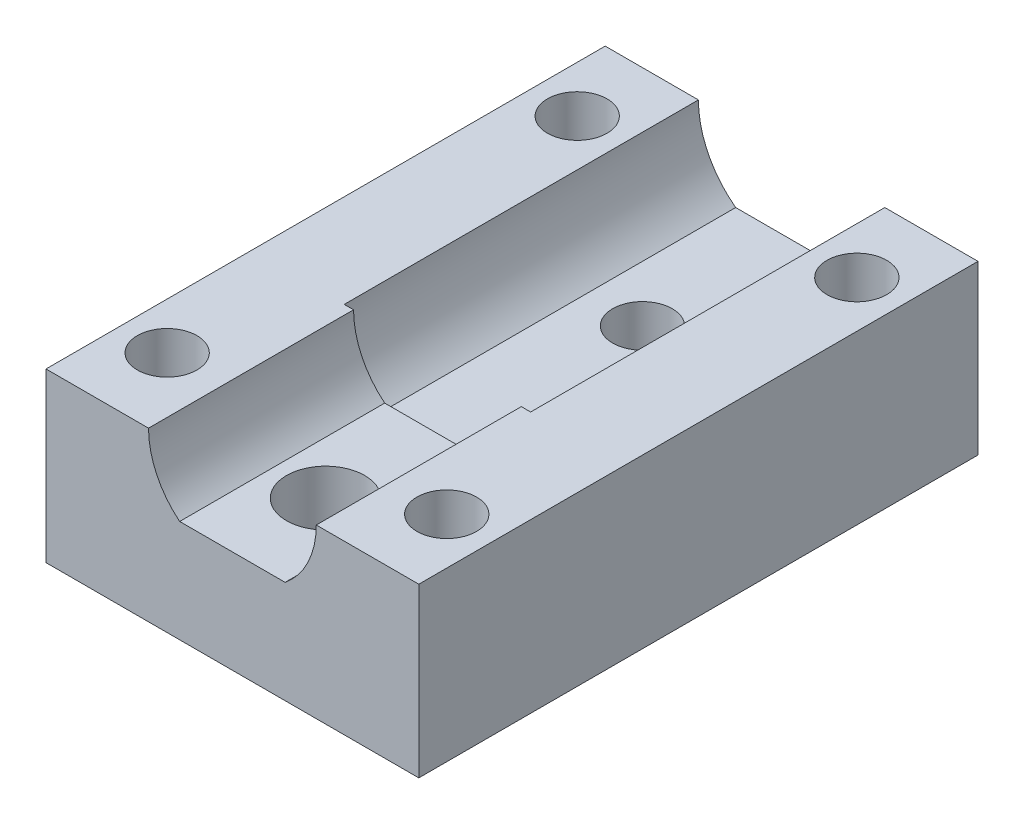
ISO-10303-21;
HEADER;
FILE_DESCRIPTION(('STEP AP214'),'2;1');
FILE_NAME('part.step','',(''),(''),'','','');
FILE_SCHEMA(('AUTOMOTIVE_DESIGN { 1 0 10303 214 1 1 1 1 }'));
ENDSEC;
DATA;
#1=APPLICATION_CONTEXT('core data for automotive mechanical design processes');
#2=APPLICATION_PROTOCOL_DEFINITION('international standard','automotive_design',2000,#1);
#3=PRODUCT_CONTEXT('',#1,'mechanical');
#4=PRODUCT('Part','Part','',(#3));
#5=PRODUCT_RELATED_PRODUCT_CATEGORY('part','',(#4));
#6=PRODUCT_DEFINITION_FORMATION('','',#4);
#7=PRODUCT_DEFINITION_CONTEXT('part definition',#1,'design');
#8=PRODUCT_DEFINITION('design','',#6,#7);
#9=PRODUCT_DEFINITION_SHAPE('','',#8);
#10=(LENGTH_UNIT() NAMED_UNIT(*) SI_UNIT(.MILLI.,.METRE.));
#11=(NAMED_UNIT(*) PLANE_ANGLE_UNIT() SI_UNIT($,.RADIAN.));
#12=(NAMED_UNIT(*) SI_UNIT($,.STERADIAN.) SOLID_ANGLE_UNIT());
#13=UNCERTAINTY_MEASURE_WITH_UNIT(LENGTH_MEASURE(1.E-05),#10,'distance_accuracy_value','');
#14=(GEOMETRIC_REPRESENTATION_CONTEXT(3) GLOBAL_UNCERTAINTY_ASSIGNED_CONTEXT((#13)) GLOBAL_UNIT_ASSIGNED_CONTEXT((#10,
#11,#12)) REPRESENTATION_CONTEXT('',''));
#15=CARTESIAN_POINT('',(0.,0.,0.));
#16=DIRECTION('',(0.,0.,1.));
#17=DIRECTION('',(1.,0.,0.));
#18=AXIS2_PLACEMENT_3D('',#15,#16,#17);
#19=CARTESIAN_POINT('',(0.,9.,4.));
#20=DIRECTION('',(0.,0.,-1.));
#21=DIRECTION('',(-1.,0.,0.));
#22=AXIS2_PLACEMENT_3D('',#19,#20,#21);
#23=PLANE('',#22);
#24=CARTESIAN_POINT('',(0.,9.,4.));
#25=DIRECTION('',(0.,0.,1.));
#26=DIRECTION('',(1.,0.,0.));
#27=AXIS2_PLACEMENT_3D('',#24,#25,#26);
#28=CIRCLE('',#27,4.5);
#29=CARTESIAN_POINT('',(2.82842712474619,5.5,4.));
#30=VERTEX_POINT('',#29);
#31=CARTESIAN_POINT('',(4.5,9.,4.));
#32=VERTEX_POINT('',#31);
#33=EDGE_CURVE('E127',#30,#32,#28,.T.);
#34=ORIENTED_EDGE('',*,*,#33,.T.);
#35=DIRECTION('',(-1.,0.,0.));
#36=VECTOR('',#35,1.);
#37=CARTESIAN_POINT('',(0.,9.,4.));
#38=LINE('',#37,#36);
#39=CARTESIAN_POINT('',(5.,9.,4.));
#40=VERTEX_POINT('',#39);
#41=EDGE_CURVE('E114',#32,#40,#38,.F.);
#42=ORIENTED_EDGE('',*,*,#41,.T.);
#43=CARTESIAN_POINT('',(0.,9.,4.));
#44=DIRECTION('',(0.,0.,-1.));
#45=DIRECTION('',(-1.,0.,0.));
#46=AXIS2_PLACEMENT_3D('',#43,#44,#45);
#47=CIRCLE('',#46,5.);
#48=CARTESIAN_POINT('',(3.,5.,4.));
#49=VERTEX_POINT('',#48);
#50=EDGE_CURVE('E113',#40,#49,#47,.T.);
#51=ORIENTED_EDGE('',*,*,#50,.T.);
#52=DIRECTION('',(1.,0.,0.));
#53=VECTOR('',#52,1.);
#54=CARTESIAN_POINT('',(3.,5.,4.));
#55=LINE('',#54,#53);
#56=CARTESIAN_POINT('',(-3.,5.,4.));
#57=VERTEX_POINT('',#56);
#58=EDGE_CURVE('E112',#49,#57,#55,.F.);
#59=ORIENTED_EDGE('',*,*,#58,.T.);
#60=CARTESIAN_POINT('',(0.,9.,4.));
#61=DIRECTION('',(0.,0.,-1.));
#62=DIRECTION('',(-1.,0.,0.));
#63=AXIS2_PLACEMENT_3D('',#60,#61,#62);
#64=CIRCLE('',#63,5.);
#65=CARTESIAN_POINT('',(-5.,9.,4.));
#66=VERTEX_POINT('',#65);
#67=EDGE_CURVE('E20',#57,#66,#64,.T.);
#68=ORIENTED_EDGE('',*,*,#67,.T.);
#69=DIRECTION('',(1.,0.,0.));
#70=VECTOR('',#69,1.);
#71=CARTESIAN_POINT('',(0.,9.,4.));
#72=LINE('',#71,#70);
#73=CARTESIAN_POINT('',(-4.5,9.,4.));
#74=VERTEX_POINT('',#73);
#75=EDGE_CURVE('E109',#74,#66,#72,.F.);
#76=ORIENTED_EDGE('',*,*,#75,.F.);
#77=CARTESIAN_POINT('',(0.,9.,4.));
#78=DIRECTION('',(0.,0.,1.));
#79=DIRECTION('',(1.,0.,0.));
#80=AXIS2_PLACEMENT_3D('',#77,#78,#79);
#81=CIRCLE('',#80,4.5);
#82=CARTESIAN_POINT('',(-2.82842712474619,5.5,4.));
#83=VERTEX_POINT('',#82);
#84=EDGE_CURVE('E199',#74,#83,#81,.T.);
#85=ORIENTED_EDGE('',*,*,#84,.T.);
#86=DIRECTION('',(1.,0.,0.));
#87=VECTOR('',#86,1.);
#88=CARTESIAN_POINT('',(-2.82842712474619,5.5,4.));
#89=LINE('',#88,#87);
#90=EDGE_CURVE('E135',#83,#30,#89,.T.);
#91=ORIENTED_EDGE('',*,*,#90,.T.);
#92=EDGE_LOOP('',(#34,#42,#51,#59,#68,#76,#85,#91));
#93=FACE_BOUND('',#92,.T.);
#94=ADVANCED_FACE('F17',(#93),#23,.T.);
#95=CARTESIAN_POINT('',(0.,9.,4.));
#96=DIRECTION('',(0.,0.,-1.));
#97=DIRECTION('',(-1.,0.,0.));
#98=AXIS2_PLACEMENT_3D('',#95,#96,#97);
#99=CYLINDRICAL_SURFACE('',#98,5.);
#100=ORIENTED_EDGE('',*,*,#67,.F.);
#101=DIRECTION('',(0.,0.,-1.));
#102=VECTOR('',#101,1.);
#103=CARTESIAN_POINT('',(-3.,5.,4.));
#104=LINE('',#103,#102);
#105=CARTESIAN_POINT('',(-3.,5.,-15.));
#106=VERTEX_POINT('',#105);
#107=EDGE_CURVE('E129',#57,#106,#104,.T.);
#108=ORIENTED_EDGE('',*,*,#107,.T.);
#109=CARTESIAN_POINT('',(0.,9.,-15.));
#110=DIRECTION('',(0.,0.,-1.));
#111=DIRECTION('',(-1.,0.,0.));
#112=AXIS2_PLACEMENT_3D('',#109,#110,#111);
#113=CIRCLE('',#112,5.);
#114=CARTESIAN_POINT('',(-5.,9.,-15.));
#115=VERTEX_POINT('',#114);
#116=EDGE_CURVE('E126',#106,#115,#113,.T.);
#117=ORIENTED_EDGE('',*,*,#116,.T.);
#118=DIRECTION('',(0.,0.,1.));
#119=VECTOR('',#118,1.);
#120=CARTESIAN_POINT('',(-5.,9.,0.));
#121=LINE('',#120,#119);
#122=EDGE_CURVE('E119',#66,#115,#121,.F.);
#123=ORIENTED_EDGE('',*,*,#122,.F.);
#124=EDGE_LOOP('',(#100,#108,#117,#123));
#125=FACE_BOUND('',#124,.T.);
#126=ADVANCED_FACE('F125',(#125),#99,.F.);
#127=CARTESIAN_POINT('',(0.,9.,4.));
#128=DIRECTION('',(0.,0.,-1.));
#129=DIRECTION('',(-1.,0.,0.));
#130=AXIS2_PLACEMENT_3D('',#127,#128,#129);
#131=CYLINDRICAL_SURFACE('',#130,5.);
#132=CARTESIAN_POINT('',(0.,9.,-15.));
#133=DIRECTION('',(0.,0.,-1.));
#134=DIRECTION('',(-1.,0.,0.));
#135=AXIS2_PLACEMENT_3D('',#132,#133,#134);
#136=CIRCLE('',#135,5.);
#137=CARTESIAN_POINT('',(5.,9.,-15.));
#138=VERTEX_POINT('',#137);
#139=CARTESIAN_POINT('',(3.,5.,-15.));
#140=VERTEX_POINT('',#139);
#141=EDGE_CURVE('E173',#138,#140,#136,.T.);
#142=ORIENTED_EDGE('',*,*,#141,.T.);
#143=DIRECTION('',(0.,0.,-1.));
#144=VECTOR('',#143,1.);
#145=CARTESIAN_POINT('',(3.,5.,4.));
#146=LINE('',#145,#144);
#147=EDGE_CURVE('E142',#140,#49,#146,.F.);
#148=ORIENTED_EDGE('',*,*,#147,.T.);
#149=ORIENTED_EDGE('',*,*,#50,.F.);
#150=DIRECTION('',(0.,0.,1.));
#151=VECTOR('',#150,1.);
#152=CARTESIAN_POINT('',(5.,9.,0.));
#153=LINE('',#152,#151);
#154=EDGE_CURVE('E209',#138,#40,#153,.T.);
#155=ORIENTED_EDGE('',*,*,#154,.F.);
#156=EDGE_LOOP('',(#142,#148,#149,#155));
#157=FACE_BOUND('',#156,.T.);
#158=ADVANCED_FACE('F347',(#157),#131,.F.);
#159=CARTESIAN_POINT('',(3.,5.,4.));
#160=DIRECTION('',(0.,-1.,0.));
#161=DIRECTION('',(0.,0.,-1.));
#162=AXIS2_PLACEMENT_3D('',#159,#160,#161);
#163=PLANE('',#162);
#164=ORIENTED_EDGE('',*,*,#107,.F.);
#165=ORIENTED_EDGE('',*,*,#58,.F.);
#166=ORIENTED_EDGE('',*,*,#147,.F.);
#167=DIRECTION('',(1.,0.,0.));
#168=VECTOR('',#167,1.);
#169=CARTESIAN_POINT('',(-10.,5.,-15.));
#170=LINE('',#169,#168);
#171=EDGE_CURVE('E176',#140,#106,#170,.F.);
#172=ORIENTED_EDGE('',*,*,#171,.T.);
#173=EDGE_LOOP('',(#164,#165,#166,#172));
#174=FACE_BOUND('',#173,.T.);
#175=CARTESIAN_POINT('',(0.,5.,-7.));
#176=DIRECTION('',(0.,-1.,0.));
#177=DIRECTION('',(0.,0.,-1.));
#178=AXIS2_PLACEMENT_3D('',#175,#176,#177);
#179=CIRCLE('',#178,1.6);
#180=CARTESIAN_POINT('',(0.,5.,-8.6));
#181=VERTEX_POINT('',#180);
#182=EDGE_CURVE('E183',#181,#181,#179,.T.);
#183=ORIENTED_EDGE('',*,*,#182,.T.);
#184=EDGE_LOOP('',(#183));
#185=FACE_BOUND('',#184,.T.);
#186=ADVANCED_FACE('F344',(#174,#185),#163,.F.);
#187=CARTESIAN_POINT('',(0.,9.,4.));
#188=DIRECTION('',(0.,0.,1.));
#189=DIRECTION('',(1.,0.,0.));
#190=AXIS2_PLACEMENT_3D('',#187,#188,#189);
#191=CYLINDRICAL_SURFACE('',#190,4.5);
#192=DIRECTION('',(0.,0.,1.));
#193=VECTOR('',#192,1.);
#194=CARTESIAN_POINT('',(4.5,9.,0.));
#195=LINE('',#194,#193);
#196=CARTESIAN_POINT('',(4.5,9.,15.));
#197=VERTEX_POINT('',#196);
#198=EDGE_CURVE('E198',#32,#197,#195,.T.);
#199=ORIENTED_EDGE('',*,*,#198,.F.);
#200=ORIENTED_EDGE('',*,*,#33,.F.);
#201=DIRECTION('',(0.,0.,-1.));
#202=VECTOR('',#201,1.);
#203=CARTESIAN_POINT('',(2.82842712474619,5.5,4.));
#204=LINE('',#203,#202);
#205=CARTESIAN_POINT('',(2.82842712474619,5.5,15.));
#206=VERTEX_POINT('',#205);
#207=EDGE_CURVE('E138',#30,#206,#204,.F.);
#208=ORIENTED_EDGE('',*,*,#207,.T.);
#209=CARTESIAN_POINT('',(0.,9.,15.));
#210=DIRECTION('',(0.,0.,1.));
#211=DIRECTION('',(1.,0.,0.));
#212=AXIS2_PLACEMENT_3D('',#209,#210,#211);
#213=CIRCLE('',#212,4.5);
#214=EDGE_CURVE('E168',#206,#197,#213,.T.);
#215=ORIENTED_EDGE('',*,*,#214,.T.);
#216=EDGE_LOOP('',(#199,#200,#208,#215));
#217=FACE_BOUND('',#216,.T.);
#218=ADVANCED_FACE('F286',(#217),#191,.F.);
#219=CARTESIAN_POINT('',(0.,9.,0.));
#220=DIRECTION('',(0.,1.,0.));
#221=DIRECTION('',(0.,0.,1.));
#222=AXIS2_PLACEMENT_3D('',#219,#220,#221);
#223=PLANE('',#222);
#224=DIRECTION('',(0.,0.,1.));
#225=VECTOR('',#224,1.);
#226=CARTESIAN_POINT('',(-4.5,9.,4.));
#227=LINE('',#226,#225);
#228=CARTESIAN_POINT('',(-4.5,9.,15.));
#229=VERTEX_POINT('',#228);
#230=EDGE_CURVE('E122',#229,#74,#227,.F.);
#231=ORIENTED_EDGE('',*,*,#230,.T.);
#232=ORIENTED_EDGE('',*,*,#75,.T.);
#233=ORIENTED_EDGE('',*,*,#122,.T.);
#234=DIRECTION('',(1.,0.,0.));
#235=VECTOR('',#234,1.);
#236=CARTESIAN_POINT('',(-10.,9.,-15.));
#237=LINE('',#236,#235);
#238=CARTESIAN_POINT('',(-10.,9.,-15.));
#239=VERTEX_POINT('',#238);
#240=EDGE_CURVE('E179',#115,#239,#237,.F.);
#241=ORIENTED_EDGE('',*,*,#240,.T.);
#242=DIRECTION('',(0.,0.,-1.));
#243=VECTOR('',#242,1.);
#244=CARTESIAN_POINT('',(-10.,9.,-15.));
#245=LINE('',#244,#243);
#246=CARTESIAN_POINT('',(-9.99999999999999,9.,15.));
#247=VERTEX_POINT('',#246);
#248=EDGE_CURVE('E172',#239,#247,#245,.F.);
#249=ORIENTED_EDGE('',*,*,#248,.T.);
#250=DIRECTION('',(-1.,0.,0.));
#251=VECTOR('',#250,1.);
#252=CARTESIAN_POINT('',(-9.99999999999999,9.,15.));
#253=LINE('',#252,#251);
#254=EDGE_CURVE('E167',#247,#229,#253,.F.);
#255=ORIENTED_EDGE('',*,*,#254,.T.);
#256=EDGE_LOOP('',(#231,#232,#233,#241,#249,#255));
#257=FACE_BOUND('',#256,.T.);
#258=CARTESIAN_POINT('',(-7.5,9.,11.));
#259=DIRECTION('',(0.,1.,0.));
#260=DIRECTION('',(0.,0.,1.));
#261=AXIS2_PLACEMENT_3D('',#258,#259,#260);
#262=CIRCLE('',#261,1.6);
#263=CARTESIAN_POINT('',(-7.5,9.,12.6));
#264=VERTEX_POINT('',#263);
#265=EDGE_CURVE('E186',#264,#264,#262,.F.);
#266=ORIENTED_EDGE('',*,*,#265,.T.);
#267=EDGE_LOOP('',(#266));
#268=FACE_BOUND('',#267,.T.);
#269=CARTESIAN_POINT('',(-7.5,9.,-11.));
#270=DIRECTION('',(0.,1.,0.));
#271=DIRECTION('',(0.,0.,1.));
#272=AXIS2_PLACEMENT_3D('',#269,#270,#271);
#273=CIRCLE('',#272,1.6);
#274=CARTESIAN_POINT('',(-7.5,9.,-9.4));
#275=VERTEX_POINT('',#274);
#276=EDGE_CURVE('E189',#275,#275,#273,.F.);
#277=ORIENTED_EDGE('',*,*,#276,.T.);
#278=EDGE_LOOP('',(#277));
#279=FACE_BOUND('',#278,.T.);
#280=ADVANCED_FACE('F117',(#257,#268,#279),#223,.T.);
#281=CARTESIAN_POINT('',(0.,9.,4.));
#282=DIRECTION('',(0.,0.,1.));
#283=DIRECTION('',(1.,0.,0.));
#284=AXIS2_PLACEMENT_3D('',#281,#282,#283);
#285=CYLINDRICAL_SURFACE('',#284,4.5);
#286=DIRECTION('',(0.,0.,-1.));
#287=VECTOR('',#286,1.);
#288=CARTESIAN_POINT('',(-2.82842712474619,5.5,4.));
#289=LINE('',#288,#287);
#290=CARTESIAN_POINT('',(-2.82842712474619,5.5,15.));
#291=VERTEX_POINT('',#290);
#292=EDGE_CURVE('E139',#291,#83,#289,.T.);
#293=ORIENTED_EDGE('',*,*,#292,.T.);
#294=ORIENTED_EDGE('',*,*,#84,.F.);
#295=ORIENTED_EDGE('',*,*,#230,.F.);
#296=CARTESIAN_POINT('',(0.,9.,15.));
#297=DIRECTION('',(0.,0.,1.));
#298=DIRECTION('',(1.,0.,0.));
#299=AXIS2_PLACEMENT_3D('',#296,#297,#298);
#300=CIRCLE('',#299,4.5);
#301=EDGE_CURVE('E163',#229,#291,#300,.T.);
#302=ORIENTED_EDGE('',*,*,#301,.T.);
#303=EDGE_LOOP('',(#293,#294,#295,#302));
#304=FACE_BOUND('',#303,.T.);
#305=ADVANCED_FACE('F283',(#304),#285,.F.);
#306=CARTESIAN_POINT('',(-2.82842712474619,5.5,4.));
#307=DIRECTION('',(0.,-1.,0.));
#308=DIRECTION('',(0.,0.,-1.));
#309=AXIS2_PLACEMENT_3D('',#306,#307,#308);
#310=PLANE('',#309);
#311=ORIENTED_EDGE('',*,*,#207,.F.);
#312=ORIENTED_EDGE('',*,*,#90,.F.);
#313=ORIENTED_EDGE('',*,*,#292,.F.);
#314=DIRECTION('',(-1.,0.,0.));
#315=VECTOR('',#314,1.);
#316=CARTESIAN_POINT('',(-9.99999999999999,5.5,15.));
#317=LINE('',#316,#315);
#318=EDGE_CURVE('E166',#291,#206,#317,.F.);
#319=ORIENTED_EDGE('',*,*,#318,.T.);
#320=EDGE_LOOP('',(#311,#312,#313,#319));
#321=FACE_BOUND('',#320,.T.);
#322=CARTESIAN_POINT('',(0.,5.5,10.));
#323=DIRECTION('',(0.,-1.,0.));
#324=DIRECTION('',(0.,0.,-1.));
#325=AXIS2_PLACEMENT_3D('',#322,#323,#324);
#326=CIRCLE('',#325,2.1);
#327=CARTESIAN_POINT('',(0.,5.5,7.9));
#328=VERTEX_POINT('',#327);
#329=EDGE_CURVE('E180',#328,#328,#326,.T.);
#330=ORIENTED_EDGE('',*,*,#329,.T.);
#331=EDGE_LOOP('',(#330));
#332=FACE_BOUND('',#331,.T.);
#333=ADVANCED_FACE('F274',(#321,#332),#310,.F.);
#334=CARTESIAN_POINT('',(0.,9.,0.));
#335=DIRECTION('',(0.,1.,0.));
#336=DIRECTION('',(0.,0.,1.));
#337=AXIS2_PLACEMENT_3D('',#334,#335,#336);
#338=PLANE('',#337);
#339=DIRECTION('',(0.,0.,1.));
#340=VECTOR('',#339,1.);
#341=CARTESIAN_POINT('',(10.,9.,-15.));
#342=LINE('',#341,#340);
#343=CARTESIAN_POINT('',(10.,9.,15.));
#344=VERTEX_POINT('',#343);
#345=CARTESIAN_POINT('',(10.,9.,-15.));
#346=VERTEX_POINT('',#345);
#347=EDGE_CURVE('E212',#344,#346,#342,.F.);
#348=ORIENTED_EDGE('',*,*,#347,.T.);
#349=DIRECTION('',(1.,0.,0.));
#350=VECTOR('',#349,1.);
#351=CARTESIAN_POINT('',(-10.,9.,-15.));
#352=LINE('',#351,#350);
#353=EDGE_CURVE('E177',#346,#138,#352,.F.);
#354=ORIENTED_EDGE('',*,*,#353,.T.);
#355=ORIENTED_EDGE('',*,*,#154,.T.);
#356=ORIENTED_EDGE('',*,*,#41,.F.);
#357=ORIENTED_EDGE('',*,*,#198,.T.);
#358=DIRECTION('',(-1.,0.,0.));
#359=VECTOR('',#358,1.);
#360=CARTESIAN_POINT('',(-9.99999999999999,9.,15.));
#361=LINE('',#360,#359);
#362=EDGE_CURVE('E171',#197,#344,#361,.F.);
#363=ORIENTED_EDGE('',*,*,#362,.T.);
#364=EDGE_LOOP('',(#348,#354,#355,#356,#357,#363));
#365=FACE_BOUND('',#364,.T.);
#366=CARTESIAN_POINT('',(7.5,9.,-11.));
#367=DIRECTION('',(0.,1.,0.));
#368=DIRECTION('',(0.,0.,1.));
#369=AXIS2_PLACEMENT_3D('',#366,#367,#368);
#370=CIRCLE('',#369,1.6);
#371=CARTESIAN_POINT('',(7.5,9.,-9.40000000000001));
#372=VERTEX_POINT('',#371);
#373=EDGE_CURVE('E192',#372,#372,#370,.F.);
#374=ORIENTED_EDGE('',*,*,#373,.T.);
#375=EDGE_LOOP('',(#374));
#376=FACE_BOUND('',#375,.T.);
#377=CARTESIAN_POINT('',(7.5,9.,11.));
#378=DIRECTION('',(0.,1.,0.));
#379=DIRECTION('',(0.,0.,1.));
#380=AXIS2_PLACEMENT_3D('',#377,#378,#379);
#381=CIRCLE('',#380,1.6);
#382=CARTESIAN_POINT('',(7.5,9.,12.6));
#383=VERTEX_POINT('',#382);
#384=EDGE_CURVE('E195',#383,#383,#381,.F.);
#385=ORIENTED_EDGE('',*,*,#384,.T.);
#386=EDGE_LOOP('',(#385));
#387=FACE_BOUND('',#386,.T.);
#388=ADVANCED_FACE('F287',(#365,#376,#387),#338,.T.);
#389=CARTESIAN_POINT('',(7.5,-10.,11.));
#390=DIRECTION('',(0.,1.,0.));
#391=DIRECTION('',(0.,0.,1.));
#392=AXIS2_PLACEMENT_3D('',#389,#390,#391);
#393=CYLINDRICAL_SURFACE('',#392,1.6);
#394=CARTESIAN_POINT('',(7.5,0.,11.));
#395=DIRECTION('',(0.,1.,0.));
#396=DIRECTION('',(0.,0.,1.));
#397=AXIS2_PLACEMENT_3D('',#394,#395,#396);
#398=CIRCLE('',#397,1.6);
#399=CARTESIAN_POINT('',(7.5,0.,12.6));
#400=VERTEX_POINT('',#399);
#401=EDGE_CURVE('E159',#400,#400,#398,.F.);
#402=ORIENTED_EDGE('',*,*,#401,.T.);
#403=EDGE_LOOP('',(#402));
#404=FACE_BOUND('',#403,.T.);
#405=ORIENTED_EDGE('',*,*,#384,.F.);
#406=EDGE_LOOP('',(#405));
#407=FACE_BOUND('',#406,.T.);
#408=ADVANCED_FACE('F329',(#404,#407),#393,.F.);
#409=CARTESIAN_POINT('',(7.5,-10.,-11.));
#410=DIRECTION('',(0.,1.,0.));
#411=DIRECTION('',(0.,0.,1.));
#412=AXIS2_PLACEMENT_3D('',#409,#410,#411);
#413=CYLINDRICAL_SURFACE('',#412,1.6);
#414=CARTESIAN_POINT('',(7.5,0.,-11.));
#415=DIRECTION('',(0.,1.,0.));
#416=DIRECTION('',(0.,0.,1.));
#417=AXIS2_PLACEMENT_3D('',#414,#415,#416);
#418=CIRCLE('',#417,1.6);
#419=CARTESIAN_POINT('',(7.5,0.,-9.40000000000001));
#420=VERTEX_POINT('',#419);
#421=EDGE_CURVE('E156',#420,#420,#418,.F.);
#422=ORIENTED_EDGE('',*,*,#421,.T.);
#423=EDGE_LOOP('',(#422));
#424=FACE_BOUND('',#423,.T.);
#425=ORIENTED_EDGE('',*,*,#373,.F.);
#426=EDGE_LOOP('',(#425));
#427=FACE_BOUND('',#426,.T.);
#428=ADVANCED_FACE('F325',(#424,#427),#413,.F.);
#429=CARTESIAN_POINT('',(-7.5,-10.,-11.));
#430=DIRECTION('',(0.,1.,0.));
#431=DIRECTION('',(0.,0.,1.));
#432=AXIS2_PLACEMENT_3D('',#429,#430,#431);
#433=CYLINDRICAL_SURFACE('',#432,1.6);
#434=CARTESIAN_POINT('',(-7.5,0.,-11.));
#435=DIRECTION('',(0.,1.,0.));
#436=DIRECTION('',(0.,0.,1.));
#437=AXIS2_PLACEMENT_3D('',#434,#435,#436);
#438=CIRCLE('',#437,1.6);
#439=CARTESIAN_POINT('',(-7.5,0.,-9.4));
#440=VERTEX_POINT('',#439);
#441=EDGE_CURVE('E153',#440,#440,#438,.F.);
#442=ORIENTED_EDGE('',*,*,#441,.T.);
#443=EDGE_LOOP('',(#442));
#444=FACE_BOUND('',#443,.T.);
#445=ORIENTED_EDGE('',*,*,#276,.F.);
#446=EDGE_LOOP('',(#445));
#447=FACE_BOUND('',#446,.T.);
#448=ADVANCED_FACE('F321',(#444,#447),#433,.F.);
#449=CARTESIAN_POINT('',(-7.5,-10.,11.));
#450=DIRECTION('',(0.,1.,0.));
#451=DIRECTION('',(0.,0.,1.));
#452=AXIS2_PLACEMENT_3D('',#449,#450,#451);
#453=CYLINDRICAL_SURFACE('',#452,1.6);
#454=CARTESIAN_POINT('',(-7.5,0.,11.));
#455=DIRECTION('',(0.,1.,0.));
#456=DIRECTION('',(0.,0.,1.));
#457=AXIS2_PLACEMENT_3D('',#454,#455,#456);
#458=CIRCLE('',#457,1.6);
#459=CARTESIAN_POINT('',(-7.5,0.,12.6));
#460=VERTEX_POINT('',#459);
#461=EDGE_CURVE('E150',#460,#460,#458,.F.);
#462=ORIENTED_EDGE('',*,*,#461,.T.);
#463=EDGE_LOOP('',(#462));
#464=FACE_BOUND('',#463,.T.);
#465=ORIENTED_EDGE('',*,*,#265,.F.);
#466=EDGE_LOOP('',(#465));
#467=FACE_BOUND('',#466,.T.);
#468=ADVANCED_FACE('F317',(#464,#467),#453,.F.);
#469=CARTESIAN_POINT('',(0.,19.,-7.));
#470=DIRECTION('',(0.,-1.,0.));
#471=DIRECTION('',(0.,0.,-1.));
#472=AXIS2_PLACEMENT_3D('',#469,#470,#471);
#473=CYLINDRICAL_SURFACE('',#472,1.6);
#474=ORIENTED_EDGE('',*,*,#182,.F.);
#475=EDGE_LOOP('',(#474));
#476=FACE_BOUND('',#475,.T.);
#477=CARTESIAN_POINT('',(0.,0.,-7.));
#478=DIRECTION('',(0.,-1.,0.));
#479=DIRECTION('',(0.,0.,-1.));
#480=AXIS2_PLACEMENT_3D('',#477,#478,#479);
#481=CIRCLE('',#480,1.6);
#482=CARTESIAN_POINT('',(0.,0.,-8.6));
#483=VERTEX_POINT('',#482);
#484=EDGE_CURVE('E147',#483,#483,#481,.T.);
#485=ORIENTED_EDGE('',*,*,#484,.T.);
#486=EDGE_LOOP('',(#485));
#487=FACE_BOUND('',#486,.T.);
#488=ADVANCED_FACE('F313',(#476,#487),#473,.F.);
#489=CARTESIAN_POINT('',(0.,19.,10.));
#490=DIRECTION('',(0.,-1.,0.));
#491=DIRECTION('',(0.,0.,-1.));
#492=AXIS2_PLACEMENT_3D('',#489,#490,#491);
#493=CYLINDRICAL_SURFACE('',#492,2.1);
#494=ORIENTED_EDGE('',*,*,#329,.F.);
#495=EDGE_LOOP('',(#494));
#496=FACE_BOUND('',#495,.T.);
#497=CARTESIAN_POINT('',(0.,0.,10.));
#498=DIRECTION('',(0.,-1.,0.));
#499=DIRECTION('',(0.,0.,-1.));
#500=AXIS2_PLACEMENT_3D('',#497,#498,#499);
#501=CIRCLE('',#500,2.1);
#502=CARTESIAN_POINT('',(0.,0.,7.9));
#503=VERTEX_POINT('',#502);
#504=EDGE_CURVE('E143',#503,#503,#501,.T.);
#505=ORIENTED_EDGE('',*,*,#504,.T.);
#506=EDGE_LOOP('',(#505));
#507=FACE_BOUND('',#506,.T.);
#508=ADVANCED_FACE('F310',(#496,#507),#493,.F.);
#509=CARTESIAN_POINT('',(-10.,9.,-15.));
#510=DIRECTION('',(0.,0.,1.));
#511=DIRECTION('',(1.,0.,0.));
#512=AXIS2_PLACEMENT_3D('',#509,#510,#511);
#513=PLANE('',#512);
#514=ORIENTED_EDGE('',*,*,#141,.F.);
#515=ORIENTED_EDGE('',*,*,#353,.F.);
#516=DIRECTION('',(0.,1.,0.));
#517=VECTOR('',#516,1.);
#518=CARTESIAN_POINT('',(10.,9.,-15.));
#519=LINE('',#518,#517);
#520=CARTESIAN_POINT('',(10.,0.,-15.));
#521=VERTEX_POINT('',#520);
#522=EDGE_CURVE('E162',#346,#521,#519,.F.);
#523=ORIENTED_EDGE('',*,*,#522,.T.);
#524=DIRECTION('',(1.,0.,0.));
#525=VECTOR('',#524,1.);
#526=CARTESIAN_POINT('',(0.,0.,-15.));
#527=LINE('',#526,#525);
#528=CARTESIAN_POINT('',(-10.,0.,-15.));
#529=VERTEX_POINT('',#528);
#530=EDGE_CURVE('E146',#521,#529,#527,.F.);
#531=ORIENTED_EDGE('',*,*,#530,.T.);
#532=DIRECTION('',(0.,1.,0.));
#533=VECTOR('',#532,1.);
#534=CARTESIAN_POINT('',(-10.,9.,-15.));
#535=LINE('',#534,#533);
#536=EDGE_CURVE('E228',#529,#239,#535,.T.);
#537=ORIENTED_EDGE('',*,*,#536,.T.);
#538=ORIENTED_EDGE('',*,*,#240,.F.);
#539=ORIENTED_EDGE('',*,*,#116,.F.);
#540=ORIENTED_EDGE('',*,*,#171,.F.);
#541=EDGE_LOOP('',(#514,#515,#523,#531,#537,#538,#539,#540));
#542=FACE_BOUND('',#541,.T.);
#543=ADVANCED_FACE('F307',(#542),#513,.F.);
#544=CARTESIAN_POINT('',(-10.,9.,-15.));
#545=DIRECTION('',(1.,0.,0.));
#546=DIRECTION('',(0.,0.,-1.));
#547=AXIS2_PLACEMENT_3D('',#544,#545,#546);
#548=PLANE('',#547);
#549=DIRECTION('',(0.,1.,0.));
#550=VECTOR('',#549,1.);
#551=CARTESIAN_POINT('',(-9.99999999999999,9.,15.));
#552=LINE('',#551,#550);
#553=CARTESIAN_POINT('',(-9.99999999999999,0.,15.));
#554=VERTEX_POINT('',#553);
#555=EDGE_CURVE('E249',#554,#247,#552,.T.);
#556=ORIENTED_EDGE('',*,*,#555,.T.);
#557=ORIENTED_EDGE('',*,*,#248,.F.);
#558=ORIENTED_EDGE('',*,*,#536,.F.);
#559=DIRECTION('',(0.,0.,1.));
#560=VECTOR('',#559,1.);
#561=CARTESIAN_POINT('',(-10.,0.,0.));
#562=LINE('',#561,#560);
#563=EDGE_CURVE('E232',#529,#554,#562,.T.);
#564=ORIENTED_EDGE('',*,*,#563,.T.);
#565=EDGE_LOOP('',(#556,#557,#558,#564));
#566=FACE_BOUND('',#565,.T.);
#567=ADVANCED_FACE('F302',(#566),#548,.F.);
#568=CARTESIAN_POINT('',(-9.99999999999999,9.,15.));
#569=DIRECTION('',(0.,0.,-1.));
#570=DIRECTION('',(-1.,0.,0.));
#571=AXIS2_PLACEMENT_3D('',#568,#569,#570);
#572=PLANE('',#571);
#573=ORIENTED_EDGE('',*,*,#301,.F.);
#574=ORIENTED_EDGE('',*,*,#254,.F.);
#575=ORIENTED_EDGE('',*,*,#555,.F.);
#576=DIRECTION('',(1.,0.,0.));
#577=VECTOR('',#576,1.);
#578=CARTESIAN_POINT('',(0.,0.,15.));
#579=LINE('',#578,#577);
#580=CARTESIAN_POINT('',(10.,0.,15.));
#581=VERTEX_POINT('',#580);
#582=EDGE_CURVE('E26',#554,#581,#579,.T.);
#583=ORIENTED_EDGE('',*,*,#582,.T.);
#584=DIRECTION('',(0.,1.,0.));
#585=VECTOR('',#584,1.);
#586=CARTESIAN_POINT('',(10.,9.,15.));
#587=LINE('',#586,#585);
#588=EDGE_CURVE('E34',#581,#344,#587,.T.);
#589=ORIENTED_EDGE('',*,*,#588,.T.);
#590=ORIENTED_EDGE('',*,*,#362,.F.);
#591=ORIENTED_EDGE('',*,*,#214,.F.);
#592=ORIENTED_EDGE('',*,*,#318,.F.);
#593=EDGE_LOOP('',(#573,#574,#575,#583,#589,#590,#591,#592));
#594=FACE_BOUND('',#593,.T.);
#595=ADVANCED_FACE('F279',(#594),#572,.F.);
#596=CARTESIAN_POINT('',(10.,9.,-15.));
#597=DIRECTION('',(-1.,0.,0.));
#598=DIRECTION('',(0.,0.,1.));
#599=AXIS2_PLACEMENT_3D('',#596,#597,#598);
#600=PLANE('',#599);
#601=ORIENTED_EDGE('',*,*,#522,.F.);
#602=ORIENTED_EDGE('',*,*,#347,.F.);
#603=ORIENTED_EDGE('',*,*,#588,.F.);
#604=DIRECTION('',(0.,0.,1.));
#605=VECTOR('',#604,1.);
#606=CARTESIAN_POINT('',(10.,0.,0.));
#607=LINE('',#606,#605);
#608=EDGE_CURVE('E11',#581,#521,#607,.F.);
#609=ORIENTED_EDGE('',*,*,#608,.T.);
#610=EDGE_LOOP('',(#601,#602,#603,#609));
#611=FACE_BOUND('',#610,.T.);
#612=ADVANCED_FACE('F293',(#611),#600,.F.);
#613=CARTESIAN_POINT('',(0.,0.,0.));
#614=DIRECTION('',(0.,1.,0.));
#615=DIRECTION('',(0.,0.,1.));
#616=AXIS2_PLACEMENT_3D('',#613,#614,#615);
#617=PLANE('',#616);
#618=ORIENTED_EDGE('',*,*,#582,.F.);
#619=ORIENTED_EDGE('',*,*,#563,.F.);
#620=ORIENTED_EDGE('',*,*,#530,.F.);
#621=ORIENTED_EDGE('',*,*,#608,.F.);
#622=EDGE_LOOP('',(#618,#619,#620,#621));
#623=FACE_BOUND('',#622,.T.);
#624=ORIENTED_EDGE('',*,*,#504,.F.);
#625=EDGE_LOOP('',(#624));
#626=FACE_BOUND('',#625,.T.);
#627=ORIENTED_EDGE('',*,*,#484,.F.);
#628=EDGE_LOOP('',(#627));
#629=FACE_BOUND('',#628,.T.);
#630=ORIENTED_EDGE('',*,*,#461,.F.);
#631=EDGE_LOOP('',(#630));
#632=FACE_BOUND('',#631,.T.);
#633=ORIENTED_EDGE('',*,*,#441,.F.);
#634=EDGE_LOOP('',(#633));
#635=FACE_BOUND('',#634,.T.);
#636=ORIENTED_EDGE('',*,*,#421,.F.);
#637=EDGE_LOOP('',(#636));
#638=FACE_BOUND('',#637,.T.);
#639=ORIENTED_EDGE('',*,*,#401,.F.);
#640=EDGE_LOOP('',(#639));
#641=FACE_BOUND('',#640,.T.);
#642=ADVANCED_FACE('F291',(#623,#626,#629,#632,#635,#638,#641),#617,.F.);
#643=CLOSED_SHELL('',(#94,#126,#158,#186,#218,#280,#305,#333,#388,#408,#428,#448,#468,#488,#508,
#543,#567,#595,#612,#642));
#644=MANIFOLD_SOLID_BREP('B1',#643);
#645=ADVANCED_BREP_SHAPE_REPRESENTATION('',(#18,#644),#14);
#646=SHAPE_DEFINITION_REPRESENTATION(#9,#645);
ENDSEC;
END-ISO-10303-21;
